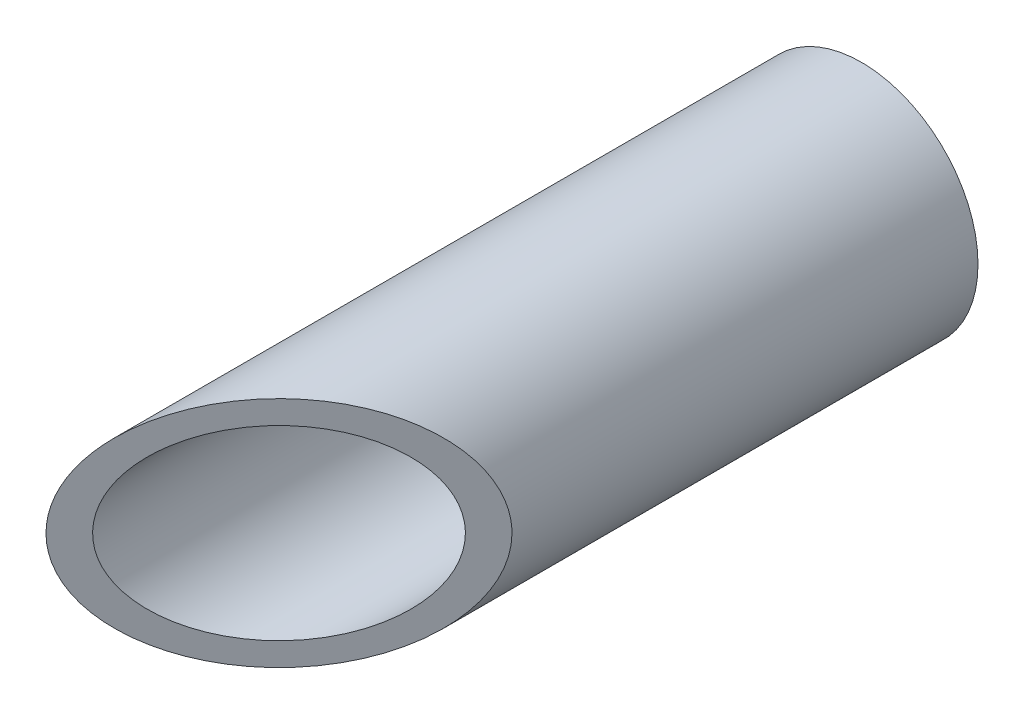
ISO-10303-21;
HEADER;
FILE_DESCRIPTION(('STEP AP214'),'2;1');
FILE_NAME('part.step','',(''),(''),'','','');
FILE_SCHEMA(('AUTOMOTIVE_DESIGN { 1 0 10303 214 1 1 1 1 }'));
ENDSEC;
DATA;
#1=APPLICATION_CONTEXT('core data for automotive mechanical design processes');
#2=APPLICATION_PROTOCOL_DEFINITION('international standard','automotive_design',2000,#1);
#3=PRODUCT_CONTEXT('',#1,'mechanical');
#4=PRODUCT('Part','Part','',(#3));
#5=PRODUCT_RELATED_PRODUCT_CATEGORY('part','',(#4));
#6=PRODUCT_DEFINITION_FORMATION('','',#4);
#7=PRODUCT_DEFINITION_CONTEXT('part definition',#1,'design');
#8=PRODUCT_DEFINITION('design','',#6,#7);
#9=PRODUCT_DEFINITION_SHAPE('','',#8);
#10=(LENGTH_UNIT() NAMED_UNIT(*) SI_UNIT(.MILLI.,.METRE.));
#11=(NAMED_UNIT(*) PLANE_ANGLE_UNIT() SI_UNIT($,.RADIAN.));
#12=(NAMED_UNIT(*) SI_UNIT($,.STERADIAN.) SOLID_ANGLE_UNIT());
#13=UNCERTAINTY_MEASURE_WITH_UNIT(LENGTH_MEASURE(1.E-05),#10,'distance_accuracy_value','');
#14=(GEOMETRIC_REPRESENTATION_CONTEXT(3) GLOBAL_UNCERTAINTY_ASSIGNED_CONTEXT((#13)) GLOBAL_UNIT_ASSIGNED_CONTEXT((#10,
#11,#12)) REPRESENTATION_CONTEXT('',''));
#15=CARTESIAN_POINT('',(0.,0.,0.));
#16=DIRECTION('',(0.,0.,1.));
#17=DIRECTION('',(1.,0.,0.));
#18=AXIS2_PLACEMENT_3D('',#15,#16,#17);
#19=CARTESIAN_POINT('',(0.,0.,0.));
#20=DIRECTION('',(0.,0.,1.));
#21=DIRECTION('',(1.,0.,0.));
#22=AXIS2_PLACEMENT_3D('',#19,#20,#21);
#23=PLANE('',#22);
#24=CARTESIAN_POINT('',(0.,0.,0.));
#25=DIRECTION('',(0.,0.,1.));
#26=DIRECTION('',(1.,0.,0.));
#27=AXIS2_PLACEMENT_3D('',#24,#25,#26);
#28=CIRCLE('',#27,25.);
#29=CARTESIAN_POINT('',(25.,0.,0.));
#30=VERTEX_POINT('',#29);
#31=EDGE_CURVE('E10',#30,#30,#28,.T.);
#32=ORIENTED_EDGE('',*,*,#31,.F.);
#33=EDGE_LOOP('',(#32));
#34=FACE_BOUND('',#33,.T.);
#35=CARTESIAN_POINT('',(0.,0.,0.));
#36=DIRECTION('',(0.,0.,1.));
#37=DIRECTION('',(1.,0.,0.));
#38=AXIS2_PLACEMENT_3D('',#35,#36,#37);
#39=CIRCLE('',#38,20.);
#40=CARTESIAN_POINT('',(20.,0.,0.));
#41=VERTEX_POINT('',#40);
#42=EDGE_CURVE('E46',#41,#41,#39,.T.);
#43=ORIENTED_EDGE('',*,*,#42,.T.);
#44=EDGE_LOOP('',(#43));
#45=FACE_BOUND('',#44,.T.);
#46=ADVANCED_FACE('F37',(#34,#45),#23,.F.);
#47=CARTESIAN_POINT('',(0.,0.,150.));
#48=DIRECTION('',(0.,0.,-1.));
#49=DIRECTION('',(-1.,0.,0.));
#50=AXIS2_PLACEMENT_3D('',#47,#48,#49);
#51=CYLINDRICAL_SURFACE('',#50,25.);
#52=CARTESIAN_POINT('',(0.,0.,125.));
#53=DIRECTION('',(-0.707106781186548,0.,-0.707106781186547));
#54=DIRECTION('',(0.707106781186547,0.,-0.707106781186548));
#55=AXIS2_PLACEMENT_3D('',#52,#53,#54);
#56=ELLIPSE('',#55,35.3553390593274,25.);
#57=CARTESIAN_POINT('',(25.,0.,100.));
#58=VERTEX_POINT('',#57);
#59=EDGE_CURVE('E51',#58,#58,#56,.T.);
#60=ORIENTED_EDGE('',*,*,#59,.T.);
#61=EDGE_LOOP('',(#60));
#62=FACE_BOUND('',#61,.T.);
#63=ORIENTED_EDGE('',*,*,#31,.T.);
#64=EDGE_LOOP('',(#63));
#65=FACE_BOUND('',#64,.T.);
#66=ADVANCED_FACE('F39',(#62,#65),#51,.T.);
#67=CARTESIAN_POINT('',(0.,0.,150.));
#68=DIRECTION('',(0.,0.,-1.));
#69=DIRECTION('',(-1.,0.,0.));
#70=AXIS2_PLACEMENT_3D('',#67,#68,#69);
#71=CYLINDRICAL_SURFACE('',#70,20.);
#72=CARTESIAN_POINT('',(0.,0.,125.));
#73=DIRECTION('',(-0.707106781186548,0.,-0.707106781186547));
#74=DIRECTION('',(0.707106781186547,0.,-0.707106781186548));
#75=AXIS2_PLACEMENT_3D('',#72,#73,#74);
#76=ELLIPSE('',#75,28.2842712474619,20.);
#77=CARTESIAN_POINT('',(20.,0.,105.));
#78=VERTEX_POINT('',#77);
#79=EDGE_CURVE('E41',#78,#78,#76,.T.);
#80=ORIENTED_EDGE('',*,*,#79,.F.);
#81=EDGE_LOOP('',(#80));
#82=FACE_BOUND('',#81,.T.);
#83=ORIENTED_EDGE('',*,*,#42,.F.);
#84=EDGE_LOOP('',(#83));
#85=FACE_BOUND('',#84,.T.);
#86=ADVANCED_FACE('F65',(#82,#85),#71,.F.);
#87=CARTESIAN_POINT('',(-25.,475.,150.));
#88=DIRECTION('',(-0.707106781186548,0.,-0.707106781186547));
#89=DIRECTION('',(-0.707106781186547,0.,0.707106781186548));
#90=AXIS2_PLACEMENT_3D('',#87,#88,#89);
#91=PLANE('',#90);
#92=ORIENTED_EDGE('',*,*,#79,.T.);
#93=EDGE_LOOP('',(#92));
#94=FACE_BOUND('',#93,.T.);
#95=ORIENTED_EDGE('',*,*,#59,.F.);
#96=EDGE_LOOP('',(#95));
#97=FACE_BOUND('',#96,.T.);
#98=ADVANCED_FACE('F62',(#94,#97),#91,.F.);
#99=CLOSED_SHELL('',(#46,#66,#86,#98));
#100=MANIFOLD_SOLID_BREP('B2',#99);
#101=ADVANCED_BREP_SHAPE_REPRESENTATION('',(#18,#100),#14);
#102=SHAPE_DEFINITION_REPRESENTATION(#9,#101);
ENDSEC;
END-ISO-10303-21;
